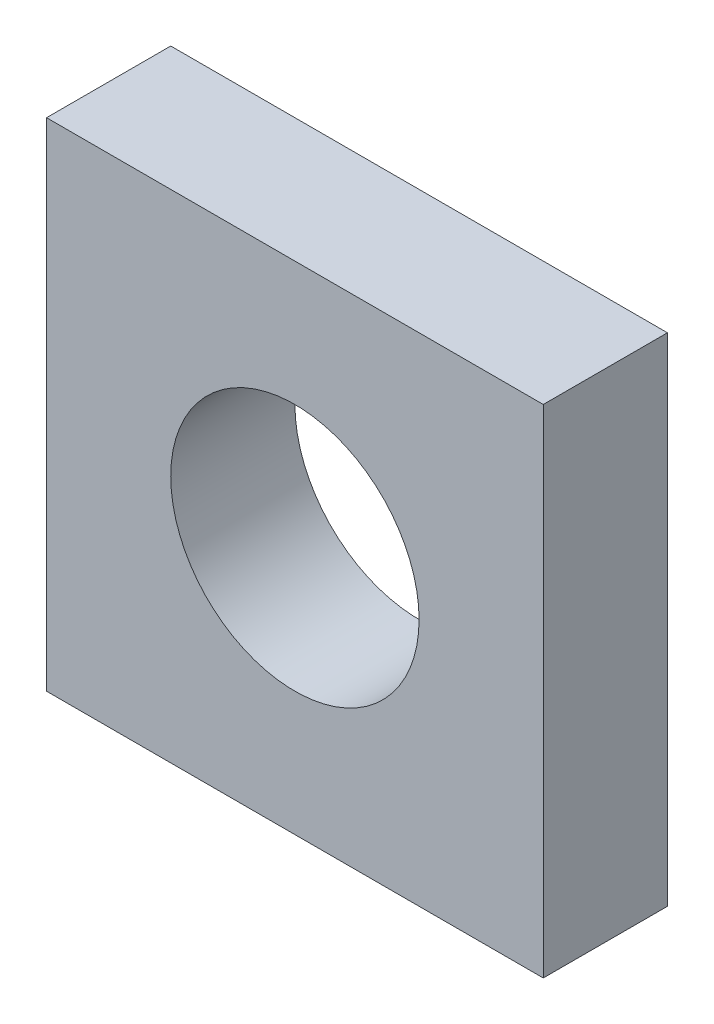
ISO-10303-21;
HEADER;
FILE_DESCRIPTION(('STEP AP214'),'2;1');
FILE_NAME('part.step','',(''),(''),'','','');
FILE_SCHEMA(('AUTOMOTIVE_DESIGN { 1 0 10303 214 1 1 1 1 }'));
ENDSEC;
DATA;
#1=APPLICATION_CONTEXT('core data for automotive mechanical design processes');
#2=APPLICATION_PROTOCOL_DEFINITION('international standard','automotive_design',2000,#1);
#3=PRODUCT_CONTEXT('',#1,'mechanical');
#4=PRODUCT('Part','Part','',(#3));
#5=PRODUCT_RELATED_PRODUCT_CATEGORY('part','',(#4));
#6=PRODUCT_DEFINITION_FORMATION('','',#4);
#7=PRODUCT_DEFINITION_CONTEXT('part definition',#1,'design');
#8=PRODUCT_DEFINITION('design','',#6,#7);
#9=PRODUCT_DEFINITION_SHAPE('','',#8);
#10=(LENGTH_UNIT() NAMED_UNIT(*) SI_UNIT(.MILLI.,.METRE.));
#11=(NAMED_UNIT(*) PLANE_ANGLE_UNIT() SI_UNIT($,.RADIAN.));
#12=(NAMED_UNIT(*) SI_UNIT($,.STERADIAN.) SOLID_ANGLE_UNIT());
#13=UNCERTAINTY_MEASURE_WITH_UNIT(LENGTH_MEASURE(1.E-05),#10,'distance_accuracy_value','');
#14=(GEOMETRIC_REPRESENTATION_CONTEXT(3) GLOBAL_UNCERTAINTY_ASSIGNED_CONTEXT((#13)) GLOBAL_UNIT_ASSIGNED_CONTEXT((#10,
#11,#12)) REPRESENTATION_CONTEXT('',''));
#15=CARTESIAN_POINT('',(0.,0.,0.));
#16=DIRECTION('',(0.,0.,1.));
#17=DIRECTION('',(1.,0.,0.));
#18=AXIS2_PLACEMENT_3D('',#15,#16,#17);
#19=CARTESIAN_POINT('',(0.,0.,0.5));
#20=DIRECTION('',(0.,0.,1.));
#21=DIRECTION('',(1.,0.,0.));
#22=AXIS2_PLACEMENT_3D('',#19,#20,#21);
#23=PLANE('',#22);
#24=DIRECTION('',(0.,-1.,0.));
#25=VECTOR('',#24,1.);
#26=CARTESIAN_POINT('',(-0.659804141436794,0.702564102564102,0.5));
#27=LINE('',#26,#25);
#28=CARTESIAN_POINT('',(-0.659804141436794,0.702564102564102,0.5));
#29=VERTEX_POINT('',#28);
#30=CARTESIAN_POINT('',(-0.659804141436793,-1.2974358974359,0.5));
#31=VERTEX_POINT('',#30);
#32=EDGE_CURVE('E85',#29,#31,#27,.T.);
#33=ORIENTED_EDGE('',*,*,#32,.T.);
#34=DIRECTION('',(1.,0.,0.));
#35=VECTOR('',#34,1.);
#36=CARTESIAN_POINT('',(-0.659804141436793,-1.2974358974359,0.5));
#37=LINE('',#36,#35);
#38=CARTESIAN_POINT('',(1.34019585856321,-1.2974358974359,0.5));
#39=VERTEX_POINT('',#38);
#40=EDGE_CURVE('E80',#31,#39,#37,.T.);
#41=ORIENTED_EDGE('',*,*,#40,.T.);
#42=DIRECTION('',(0.,1.,0.));
#43=VECTOR('',#42,1.);
#44=CARTESIAN_POINT('',(1.34019585856321,0.702564102564102,0.5));
#45=LINE('',#44,#43);
#46=CARTESIAN_POINT('',(1.34019585856321,0.702564102564102,0.5));
#47=VERTEX_POINT('',#46);
#48=EDGE_CURVE('E83',#39,#47,#45,.T.);
#49=ORIENTED_EDGE('',*,*,#48,.T.);
#50=DIRECTION('',(-1.,0.,0.));
#51=VECTOR('',#50,1.);
#52=CARTESIAN_POINT('',(-0.659804141436794,0.702564102564102,0.5));
#53=LINE('',#52,#51);
#54=EDGE_CURVE('E50',#47,#29,#53,.T.);
#55=ORIENTED_EDGE('',*,*,#54,.T.);
#56=EDGE_LOOP('',(#33,#41,#49,#55));
#57=FACE_BOUND('',#56,.T.);
#58=CARTESIAN_POINT('',(0.340195858563207,-0.297435897435898,0.5));
#59=DIRECTION('',(0.,0.,1.));
#60=DIRECTION('',(1.,0.,0.));
#61=AXIS2_PLACEMENT_3D('',#58,#59,#60);
#62=CIRCLE('',#61,0.5);
#63=CARTESIAN_POINT('',(0.840195858563207,-0.297435897435898,0.5));
#64=VERTEX_POINT('',#63);
#65=EDGE_CURVE('E100',#64,#64,#62,.T.);
#66=ORIENTED_EDGE('',*,*,#65,.F.);
#67=EDGE_LOOP('',(#66));
#68=FACE_BOUND('',#67,.T.);
#69=ADVANCED_FACE('F33',(#57,#68),#23,.T.);
#70=CARTESIAN_POINT('',(0.,0.,0.));
#71=DIRECTION('',(0.,0.,1.));
#72=DIRECTION('',(1.,0.,0.));
#73=AXIS2_PLACEMENT_3D('',#70,#71,#72);
#74=PLANE('',#73);
#75=DIRECTION('',(0.,-1.,0.));
#76=VECTOR('',#75,1.);
#77=CARTESIAN_POINT('',(-0.659804141436794,0.702564102564102,0.));
#78=LINE('',#77,#76);
#79=CARTESIAN_POINT('',(-0.659804141436794,0.702564102564102,0.));
#80=VERTEX_POINT('',#79);
#81=CARTESIAN_POINT('',(-0.659804141436793,-1.2974358974359,0.));
#82=VERTEX_POINT('',#81);
#83=EDGE_CURVE('E97',#80,#82,#78,.T.);
#84=ORIENTED_EDGE('',*,*,#83,.F.);
#85=DIRECTION('',(-1.,0.,0.));
#86=VECTOR('',#85,1.);
#87=CARTESIAN_POINT('',(-0.659804141436794,0.702564102564102,0.));
#88=LINE('',#87,#86);
#89=CARTESIAN_POINT('',(1.34019585856321,0.702564102564102,0.));
#90=VERTEX_POINT('',#89);
#91=EDGE_CURVE('E73',#90,#80,#88,.T.);
#92=ORIENTED_EDGE('',*,*,#91,.F.);
#93=DIRECTION('',(0.,1.,0.));
#94=VECTOR('',#93,1.);
#95=CARTESIAN_POINT('',(1.34019585856321,0.702564102564102,0.));
#96=LINE('',#95,#94);
#97=CARTESIAN_POINT('',(1.34019585856321,-1.2974358974359,0.));
#98=VERTEX_POINT('',#97);
#99=EDGE_CURVE('E67',#98,#90,#96,.T.);
#100=ORIENTED_EDGE('',*,*,#99,.F.);
#101=DIRECTION('',(1.,0.,0.));
#102=VECTOR('',#101,1.);
#103=CARTESIAN_POINT('',(-0.659804141436793,-1.2974358974359,0.));
#104=LINE('',#103,#102);
#105=EDGE_CURVE('E89',#82,#98,#104,.T.);
#106=ORIENTED_EDGE('',*,*,#105,.F.);
#107=EDGE_LOOP('',(#84,#92,#100,#106));
#108=FACE_BOUND('',#107,.T.);
#109=CARTESIAN_POINT('',(0.340195858563207,-0.297435897435898,0.));
#110=DIRECTION('',(0.,0.,1.));
#111=DIRECTION('',(1.,0.,0.));
#112=AXIS2_PLACEMENT_3D('',#109,#110,#111);
#113=CIRCLE('',#112,0.5);
#114=CARTESIAN_POINT('',(0.840195858563207,-0.297435897435898,0.));
#115=VERTEX_POINT('',#114);
#116=EDGE_CURVE('E112',#115,#115,#113,.T.);
#117=ORIENTED_EDGE('',*,*,#116,.T.);
#118=EDGE_LOOP('',(#117));
#119=FACE_BOUND('',#118,.T.);
#120=ADVANCED_FACE('F108',(#108,#119),#74,.F.);
#121=CARTESIAN_POINT('',(-0.659804141436794,0.702564102564102,0.5));
#122=DIRECTION('',(1.,0.,0.));
#123=DIRECTION('',(0.,1.,0.));
#124=AXIS2_PLACEMENT_3D('',#121,#122,#123);
#125=PLANE('',#124);
#126=ORIENTED_EDGE('',*,*,#83,.T.);
#127=DIRECTION('',(0.,0.,-1.));
#128=VECTOR('',#127,1.);
#129=CARTESIAN_POINT('',(-0.659804141436793,-1.2974358974359,0.5));
#130=LINE('',#129,#128);
#131=EDGE_CURVE('E11',#31,#82,#130,.T.);
#132=ORIENTED_EDGE('',*,*,#131,.F.);
#133=ORIENTED_EDGE('',*,*,#32,.F.);
#134=DIRECTION('',(0.,0.,-1.));
#135=VECTOR('',#134,1.);
#136=CARTESIAN_POINT('',(-0.659804141436794,0.702564102564102,0.5));
#137=LINE('',#136,#135);
#138=EDGE_CURVE('E93',#29,#80,#137,.T.);
#139=ORIENTED_EDGE('',*,*,#138,.T.);
#140=EDGE_LOOP('',(#126,#132,#133,#139));
#141=FACE_BOUND('',#140,.T.);
#142=ADVANCED_FACE('F35',(#141),#125,.F.);
#143=CARTESIAN_POINT('',(-0.659804141436793,-1.2974358974359,0.5));
#144=DIRECTION('',(0.,1.,0.));
#145=DIRECTION('',(0.,0.,1.));
#146=AXIS2_PLACEMENT_3D('',#143,#144,#145);
#147=PLANE('',#146);
#148=ORIENTED_EDGE('',*,*,#105,.T.);
#149=DIRECTION('',(0.,0.,-1.));
#150=VECTOR('',#149,1.);
#151=CARTESIAN_POINT('',(1.34019585856321,-1.2974358974359,0.5));
#152=LINE('',#151,#150);
#153=EDGE_CURVE('E42',#39,#98,#152,.T.);
#154=ORIENTED_EDGE('',*,*,#153,.F.);
#155=ORIENTED_EDGE('',*,*,#40,.F.);
#156=ORIENTED_EDGE('',*,*,#131,.T.);
#157=EDGE_LOOP('',(#148,#154,#155,#156));
#158=FACE_BOUND('',#157,.T.);
#159=ADVANCED_FACE('F88',(#158),#147,.F.);
#160=CARTESIAN_POINT('',(1.34019585856321,0.702564102564102,0.5));
#161=DIRECTION('',(-1.,0.,0.));
#162=DIRECTION('',(0.,-1.,0.));
#163=AXIS2_PLACEMENT_3D('',#160,#161,#162);
#164=PLANE('',#163);
#165=ORIENTED_EDGE('',*,*,#99,.T.);
#166=DIRECTION('',(0.,0.,-1.));
#167=VECTOR('',#166,1.);
#168=CARTESIAN_POINT('',(1.34019585856321,0.702564102564102,0.5));
#169=LINE('',#168,#167);
#170=EDGE_CURVE('E90',#47,#90,#169,.T.);
#171=ORIENTED_EDGE('',*,*,#170,.F.);
#172=ORIENTED_EDGE('',*,*,#48,.F.);
#173=ORIENTED_EDGE('',*,*,#153,.T.);
#174=EDGE_LOOP('',(#165,#171,#172,#173));
#175=FACE_BOUND('',#174,.T.);
#176=ADVANCED_FACE('F91',(#175),#164,.F.);
#177=CARTESIAN_POINT('',(-0.659804141436794,0.702564102564102,0.5));
#178=DIRECTION('',(0.,-1.,0.));
#179=DIRECTION('',(0.,0.,-1.));
#180=AXIS2_PLACEMENT_3D('',#177,#178,#179);
#181=PLANE('',#180);
#182=ORIENTED_EDGE('',*,*,#91,.T.);
#183=ORIENTED_EDGE('',*,*,#138,.F.);
#184=ORIENTED_EDGE('',*,*,#54,.F.);
#185=ORIENTED_EDGE('',*,*,#170,.T.);
#186=EDGE_LOOP('',(#182,#183,#184,#185));
#187=FACE_BOUND('',#186,.T.);
#188=ADVANCED_FACE('F105',(#187),#181,.F.);
#189=CARTESIAN_POINT('',(0.340195858563207,-0.297435897435898,0.5));
#190=DIRECTION('',(0.,0.,-1.));
#191=DIRECTION('',(-1.,0.,0.));
#192=AXIS2_PLACEMENT_3D('',#189,#190,#191);
#193=CYLINDRICAL_SURFACE('',#192,0.5);
#194=ORIENTED_EDGE('',*,*,#65,.T.);
#195=EDGE_LOOP('',(#194));
#196=FACE_BOUND('',#195,.T.);
#197=ORIENTED_EDGE('',*,*,#116,.F.);
#198=EDGE_LOOP('',(#197));
#199=FACE_BOUND('',#198,.T.);
#200=ADVANCED_FACE('F118',(#196,#199),#193,.F.);
#201=CLOSED_SHELL('',(#69,#120,#142,#159,#176,#188,#200));
#202=MANIFOLD_SOLID_BREP('B2',#201);
#203=ADVANCED_BREP_SHAPE_REPRESENTATION('',(#18,#202),#14);
#204=SHAPE_DEFINITION_REPRESENTATION(#9,#203);
ENDSEC;
END-ISO-10303-21;
